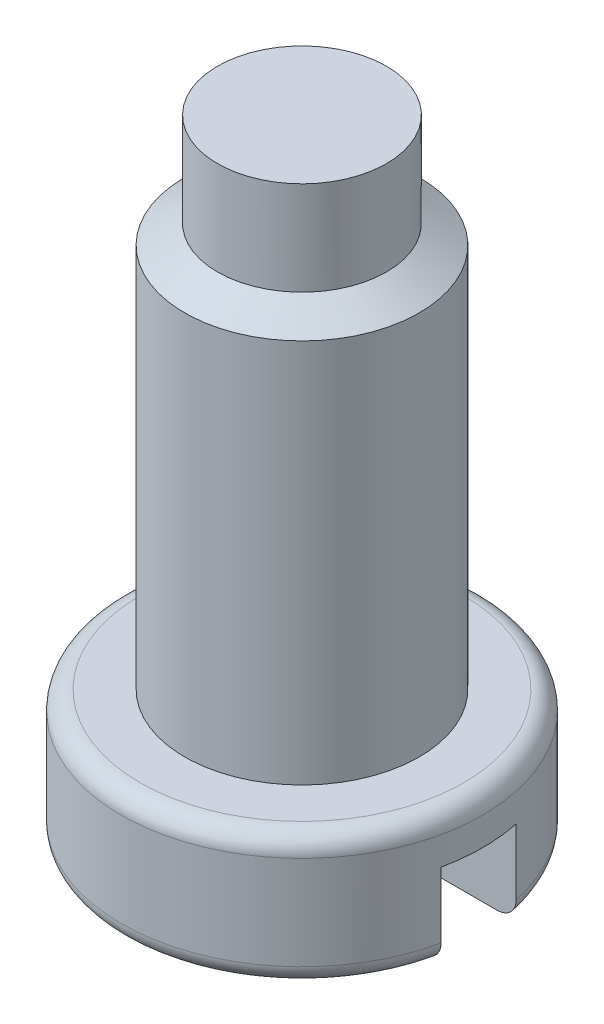
ISO-10303-21;
HEADER;
FILE_DESCRIPTION(('STEP AP214'),'2;1');
FILE_NAME('part.step','',(''),(''),'','','');
FILE_SCHEMA(('AUTOMOTIVE_DESIGN { 1 0 10303 214 1 1 1 1 }'));
ENDSEC;
DATA;
#1=APPLICATION_CONTEXT('core data for automotive mechanical design processes');
#2=APPLICATION_PROTOCOL_DEFINITION('international standard','automotive_design',2000,#1);
#3=PRODUCT_CONTEXT('',#1,'mechanical');
#4=PRODUCT('Part','Part','',(#3));
#5=PRODUCT_RELATED_PRODUCT_CATEGORY('part','',(#4));
#6=PRODUCT_DEFINITION_FORMATION('','',#4);
#7=PRODUCT_DEFINITION_CONTEXT('part definition',#1,'design');
#8=PRODUCT_DEFINITION('design','',#6,#7);
#9=PRODUCT_DEFINITION_SHAPE('','',#8);
#10=(LENGTH_UNIT() NAMED_UNIT(*) SI_UNIT(.MILLI.,.METRE.));
#11=(NAMED_UNIT(*) PLANE_ANGLE_UNIT() SI_UNIT($,.RADIAN.));
#12=(NAMED_UNIT(*) SI_UNIT($,.STERADIAN.) SOLID_ANGLE_UNIT());
#13=UNCERTAINTY_MEASURE_WITH_UNIT(LENGTH_MEASURE(1.E-05),#10,'distance_accuracy_value','');
#14=(GEOMETRIC_REPRESENTATION_CONTEXT(3) GLOBAL_UNCERTAINTY_ASSIGNED_CONTEXT((#13)) GLOBAL_UNIT_ASSIGNED_CONTEXT((#10,
#11,#12)) REPRESENTATION_CONTEXT('',''));
#15=CARTESIAN_POINT('',(0.,0.,0.));
#16=DIRECTION('',(0.,0.,1.));
#17=DIRECTION('',(1.,0.,0.));
#18=AXIS2_PLACEMENT_3D('',#15,#16,#17);
#19=CARTESIAN_POINT('',(5.91,1.7,16.95));
#20=DIRECTION('',(0.,-1.,0.));
#21=DIRECTION('',(0.,0.,-1.));
#22=AXIS2_PLACEMENT_3D('',#19,#20,#21);
#23=PLANE('',#22);
#24=CARTESIAN_POINT('',(0.,1.7,16.55));
#25=DIRECTION('',(0.,-1.,0.));
#26=DIRECTION('',(0.,0.,-1.));
#27=AXIS2_PLACEMENT_3D('',#24,#25,#26);
#28=CIRCLE('',#27,1.925);
#29=CARTESIAN_POINT('',(-1.88298300576503,1.7,16.95));
#30=VERTEX_POINT('',#29);
#31=CARTESIAN_POINT('',(-1.88298300576503,1.7,16.15));
#32=VERTEX_POINT('',#31);
#33=EDGE_CURVE('E78',#30,#32,#28,.T.);
#34=ORIENTED_EDGE('',*,*,#33,.T.);
#35=DIRECTION('',(1.,0.,0.));
#36=VECTOR('',#35,1.);
#37=CARTESIAN_POINT('',(5.91,1.7,16.15));
#38=LINE('',#37,#36);
#39=CARTESIAN_POINT('',(1.88298300576503,1.7,16.15));
#40=VERTEX_POINT('',#39);
#41=EDGE_CURVE('E80',#40,#32,#38,.F.);
#42=ORIENTED_EDGE('',*,*,#41,.F.);
#43=CARTESIAN_POINT('',(0.,1.7,16.55));
#44=DIRECTION('',(0.,-1.,0.));
#45=DIRECTION('',(0.,0.,-1.));
#46=AXIS2_PLACEMENT_3D('',#43,#44,#45);
#47=CIRCLE('',#46,1.925);
#48=CARTESIAN_POINT('',(1.88298300576503,1.7,16.95));
#49=VERTEX_POINT('',#48);
#50=EDGE_CURVE('E19',#40,#49,#47,.T.);
#51=ORIENTED_EDGE('',*,*,#50,.T.);
#52=DIRECTION('',(-1.,0.,0.));
#53=VECTOR('',#52,1.);
#54=CARTESIAN_POINT('',(5.91,1.7,16.95));
#55=LINE('',#54,#53);
#56=EDGE_CURVE('E87',#30,#49,#55,.F.);
#57=ORIENTED_EDGE('',*,*,#56,.F.);
#58=EDGE_LOOP('',(#34,#42,#51,#57));
#59=FACE_BOUND('',#58,.T.);
#60=ADVANCED_FACE('F16',(#59),#23,.T.);
#61=CARTESIAN_POINT('',(5.91,0.8,16.95));
#62=DIRECTION('',(0.,0.,-1.));
#63=DIRECTION('',(-1.,0.,0.));
#64=AXIS2_PLACEMENT_3D('',#61,#62,#63);
#65=PLANE('',#64);
#66=DIRECTION('',(0.,1.,0.));
#67=VECTOR('',#66,1.);
#68=CARTESIAN_POINT('',(-1.882983005765,0.8,16.95));
#69=LINE('',#68,#67);
#70=CARTESIAN_POINT('',(-1.88298300576503,1.,16.95));
#71=VERTEX_POINT('',#70);
#72=EDGE_CURVE('E89',#71,#30,#69,.T.);
#73=ORIENTED_EDGE('',*,*,#72,.T.);
#74=ORIENTED_EDGE('',*,*,#56,.T.);
#75=DIRECTION('',(0.,1.,0.));
#76=VECTOR('',#75,1.);
#77=CARTESIAN_POINT('',(1.882983005765,0.8,16.95));
#78=LINE('',#77,#76);
#79=CARTESIAN_POINT('',(1.88298300576503,1.,16.95));
#80=VERTEX_POINT('',#79);
#81=EDGE_CURVE('E74',#49,#80,#78,.F.);
#82=ORIENTED_EDGE('',*,*,#81,.T.);
#83=CARTESIAN_POINT('',(1.88298300576506,1.,16.95));
#84=CARTESIAN_POINT('',(1.88299347563166,0.988931574843076,16.95));
#85=CARTESIAN_POINT('',(1.88204434737266,0.977867312182217,16.95));
#86=CARTESIAN_POINT('',(1.8783056960026,0.956069104845353,16.95));
#87=CARTESIAN_POINT('',(1.87551868245182,0.94533473060846,16.95));
#88=CARTESIAN_POINT('',(1.86818161993845,0.924483467447971,16.95));
#89=CARTESIAN_POINT('',(1.86363106561843,0.914366756483745,16.95));
#90=CARTESIAN_POINT('',(1.85291153538853,0.895032206295592,16.95));
#91=CARTESIAN_POINT('',(1.84674258601823,0.885814352334973,16.95));
#92=CARTESIAN_POINT('',(1.83290967504187,0.868444958618102,16.95));
#93=CARTESIAN_POINT('',(1.82523296005815,0.860303582753486,16.95));
#94=CARTESIAN_POINT('',(1.8086458188045,0.845392527748904,16.95));
#95=CARTESIAN_POINT('',(1.79973518810624,0.838623076360581,16.95));
#96=CARTESIAN_POINT('',(1.78073608065166,0.826495402624658,16.95));
#97=CARTESIAN_POINT('',(1.77062677951454,0.821169841944041,16.95));
#98=CARTESIAN_POINT('',(1.7496724730191,0.812248699356854,16.95));
#99=CARTESIAN_POINT('',(1.7388276109373,0.808652781639017,16.95));
#100=CARTESIAN_POINT('',(1.71962129090437,0.803978647329365,16.95));
#101=CARTESIAN_POINT('',(1.71135775205097,0.802486821782124,16.95));
#102=CARTESIAN_POINT('',(1.69472437429364,0.800497521136283,16.95));
#103=CARTESIAN_POINT('',(1.68635471340121,0.799998558106696,16.95));
#104=CARTESIAN_POINT('',(1.67798241945499,0.8,16.95));
#105=B_SPLINE_CURVE_WITH_KNOTS('',3,(#83,#84,#85,#86,#87,#88,#89,#90,#91,#92,#93,#94,#95,#96,
#97,#98,#99,#100,#101,#102,#103,#104),.UNSPECIFIED.,.F.,.F.,(4,2,2,2,2,2,2,2,2,2,4),(0.,
0.0331584400419193,0.0662716970254844,0.0993944499159244,0.132516659670048,0.165932136904907,
0.199353156869892,0.233476817049018,0.267593849421269,0.292728302229871,0.317825059404467),.UNSPECIFIED.);
#106=CARTESIAN_POINT('',(1.677982419455,0.8,16.95));
#107=VERTEX_POINT('',#106);
#108=EDGE_CURVE('E97',#80,#107,#105,.T.);
#109=ORIENTED_EDGE('',*,*,#108,.T.);
#110=DIRECTION('',(1.,0.,0.));
#111=VECTOR('',#110,1.);
#112=CARTESIAN_POINT('',(0.,0.8,16.95));
#113=LINE('',#112,#111);
#114=CARTESIAN_POINT('',(-1.677982419455,0.8,16.95));
#115=VERTEX_POINT('',#114);
#116=EDGE_CURVE('E105',#115,#107,#113,.T.);
#117=ORIENTED_EDGE('',*,*,#116,.F.);
#118=CARTESIAN_POINT('',(-1.677982419455,0.8,16.95));
#119=CARTESIAN_POINT('',(-1.68974282333881,0.799991194823766,16.9500000000022));
#120=CARTESIAN_POINT('',(-1.70150318088781,0.800981078367557,16.9500000000013));
#121=CARTESIAN_POINT('',(-1.72469677261126,0.804903299902078,16.9499999999987));
#122=CARTESIAN_POINT('',(-1.73612996909695,0.807835860755747,16.949999999997));
#123=CARTESIAN_POINT('',(-1.75834906575045,0.815591879157631,16.9499999999984));
#124=CARTESIAN_POINT('',(-1.76913439134307,0.820416987405248,16.9500000000015));
#125=CARTESIAN_POINT('',(-1.78972042522975,0.831834228342233,16.9499999999985));
#126=CARTESIAN_POINT('',(-1.79952158265651,0.838425549922025,16.9499999999924));
#127=CARTESIAN_POINT('',(-1.81770326069163,0.853092062358443,16.9499999999937));
#128=CARTESIAN_POINT('',(-1.8261027161158,0.861143764615979,16.9500000000009));
#129=CARTESIAN_POINT('',(-1.84138927017368,0.878572938200564,16.9499999999991));
#130=CARTESIAN_POINT('',(-1.84827671395276,0.887950106159836,16.94999999999));
#131=CARTESIAN_POINT('',(-1.86017428150044,0.90752681891112,16.9499999999906));
#132=CARTESIAN_POINT('',(-1.86522451225429,0.917702026884014,16.9499999999998));
#133=CARTESIAN_POINT('',(-1.87350315875885,0.938763911500687,16.9500000000002));
#134=CARTESIAN_POINT('',(-1.87673324848014,0.949649924104637,16.9499999999913));
#135=CARTESIAN_POINT('',(-1.88032527373272,0.967186966849053,16.9499999999931));
#136=CARTESIAN_POINT('',(-1.88132142626072,0.973714484211891,16.9499999999972));
#137=CARTESIAN_POINT('',(-1.88265004809528,0.9868269578464,16.9500000000028));
#138=CARTESIAN_POINT('',(-1.88298349511185,0.993411815084606,16.9500000000044));
#139=CARTESIAN_POINT('',(-1.88298300576506,0.999999999999997,16.95));
#140=B_SPLINE_CURVE_WITH_KNOTS('',3,(#118,#119,#120,#121,#122,#123,#124,#125,#126,#127,#128,
#129,#130,#131,#132,#133,#134,#135,#136,#137,#138,#139),.UNSPECIFIED.,.F.,.F.,(4,2,2,2,2,2,2,2,
2,2,4),(0.,0.0352399194187343,0.0704838822431085,0.105758653819415,0.141017253615036,
0.175752271482578,0.210479352159553,0.244394958270078,0.278279321319094,0.298058128929664,
0.317807734526125),.UNSPECIFIED.);
#141=EDGE_CURVE('E96',#115,#71,#140,.T.);
#142=ORIENTED_EDGE('',*,*,#141,.T.);
#143=EDGE_LOOP('',(#73,#74,#82,#109,#117,#142));
#144=FACE_BOUND('',#143,.T.);
#145=ADVANCED_FACE('F203',(#144),#65,.T.);
#146=CARTESIAN_POINT('',(5.91,1.7,16.15));
#147=DIRECTION('',(0.,0.,1.));
#148=DIRECTION('',(1.,0.,0.));
#149=AXIS2_PLACEMENT_3D('',#146,#147,#148);
#150=PLANE('',#149);
#151=DIRECTION('',(1.,0.,0.));
#152=VECTOR('',#151,1.);
#153=CARTESIAN_POINT('',(0.,0.8,16.15));
#154=LINE('',#153,#152);
#155=CARTESIAN_POINT('',(1.677982419455,0.8,16.15));
#156=VERTEX_POINT('',#155);
#157=CARTESIAN_POINT('',(-1.677982419455,0.8,16.15));
#158=VERTEX_POINT('',#157);
#159=EDGE_CURVE('E150',#156,#158,#154,.F.);
#160=ORIENTED_EDGE('',*,*,#159,.F.);
#161=CARTESIAN_POINT('',(1.677982419455,0.8,16.15));
#162=CARTESIAN_POINT('',(1.68974282333881,0.799991194823766,16.1499999999978));
#163=CARTESIAN_POINT('',(1.70150318088781,0.800981078367557,16.1499999999987));
#164=CARTESIAN_POINT('',(1.72469677261126,0.804903299902078,16.1500000000013));
#165=CARTESIAN_POINT('',(1.73612996909695,0.807835860755748,16.150000000003));
#166=CARTESIAN_POINT('',(1.75834906575045,0.815591879157631,16.1500000000016));
#167=CARTESIAN_POINT('',(1.76913439134306,0.820416987405248,16.1499999999985));
#168=CARTESIAN_POINT('',(1.78972042522975,0.831834228342234,16.1500000000015));
#169=CARTESIAN_POINT('',(1.79952158265651,0.838425549922026,16.1500000000076));
#170=CARTESIAN_POINT('',(1.81770326069163,0.853092062358444,16.1500000000063));
#171=CARTESIAN_POINT('',(1.82610271611579,0.86114376461598,16.1499999999991));
#172=CARTESIAN_POINT('',(1.84138927017368,0.878572938200565,16.1500000000009));
#173=CARTESIAN_POINT('',(1.84827671395276,0.887950106159837,16.15000000001));
#174=CARTESIAN_POINT('',(1.86017428150044,0.907526818911122,16.1500000000094));
#175=CARTESIAN_POINT('',(1.86522451225429,0.917702026884015,16.1500000000002));
#176=CARTESIAN_POINT('',(1.87350315875884,0.938763911500687,16.1499999999998));
#177=CARTESIAN_POINT('',(1.87673324848014,0.949649924104638,16.1500000000087));
#178=CARTESIAN_POINT('',(1.88032527373272,0.967186966849053,16.1500000000069));
#179=CARTESIAN_POINT('',(1.88132142626072,0.973714484211891,16.1500000000028));
#180=CARTESIAN_POINT('',(1.88265004809528,0.9868269578464,16.1499999999972));
#181=CARTESIAN_POINT('',(1.88298349511184,0.993411815084606,16.1499999999956));
#182=CARTESIAN_POINT('',(1.88298300576506,0.999999999999997,16.15));
#183=B_SPLINE_CURVE_WITH_KNOTS('',3,(#161,#162,#163,#164,#165,#166,#167,#168,#169,#170,#171,
#172,#173,#174,#175,#176,#177,#178,#179,#180,#181,#182),.UNSPECIFIED.,.F.,.F.,(4,2,2,2,2,2,2,2,
2,2,4),(0.,0.0352399194187334,0.0704838822431072,0.105758653819414,0.141017253615035,
0.175752271482576,0.210479352159551,0.244394958270075,0.278279321319092,0.298058128929661,
0.317807734526122),.UNSPECIFIED.);
#184=CARTESIAN_POINT('',(1.88298300576503,1.,16.15));
#185=VERTEX_POINT('',#184);
#186=EDGE_CURVE('E86',#156,#185,#183,.T.);
#187=ORIENTED_EDGE('',*,*,#186,.T.);
#188=DIRECTION('',(0.,1.,0.));
#189=VECTOR('',#188,1.);
#190=CARTESIAN_POINT('',(1.882983005765,1.7,16.15));
#191=LINE('',#190,#189);
#192=EDGE_CURVE('E70',#185,#40,#191,.T.);
#193=ORIENTED_EDGE('',*,*,#192,.T.);
#194=ORIENTED_EDGE('',*,*,#41,.T.);
#195=DIRECTION('',(0.,1.,0.));
#196=VECTOR('',#195,1.);
#197=CARTESIAN_POINT('',(-1.882983005765,1.7,16.15));
#198=LINE('',#197,#196);
#199=CARTESIAN_POINT('',(-1.88298300576503,1.,16.15));
#200=VERTEX_POINT('',#199);
#201=EDGE_CURVE('E82',#32,#200,#198,.F.);
#202=ORIENTED_EDGE('',*,*,#201,.T.);
#203=CARTESIAN_POINT('',(-1.88298300576505,1.,16.15));
#204=CARTESIAN_POINT('',(-1.88299347563166,0.988931574843076,16.15));
#205=CARTESIAN_POINT('',(-1.88204434737266,0.977867312182217,16.15));
#206=CARTESIAN_POINT('',(-1.8783056960026,0.956069104845353,16.15));
#207=CARTESIAN_POINT('',(-1.87551868245182,0.94533473060846,16.15));
#208=CARTESIAN_POINT('',(-1.86818161993845,0.924483467447971,16.15));
#209=CARTESIAN_POINT('',(-1.86363106561843,0.914366756483745,16.15));
#210=CARTESIAN_POINT('',(-1.85291153538853,0.895032206295592,16.15));
#211=CARTESIAN_POINT('',(-1.84674258601822,0.885814352334973,16.15));
#212=CARTESIAN_POINT('',(-1.83290967504187,0.868444958618102,16.15));
#213=CARTESIAN_POINT('',(-1.82523296005815,0.860303582753486,16.15));
#214=CARTESIAN_POINT('',(-1.8086458188045,0.845392527748904,16.15));
#215=CARTESIAN_POINT('',(-1.79973518810623,0.838623076360581,16.15));
#216=CARTESIAN_POINT('',(-1.78073608065165,0.826495402624658,16.15));
#217=CARTESIAN_POINT('',(-1.77062677951454,0.821169841944041,16.15));
#218=CARTESIAN_POINT('',(-1.7496724730191,0.812248699356853,16.15));
#219=CARTESIAN_POINT('',(-1.73882761093729,0.808652781639016,16.15));
#220=CARTESIAN_POINT('',(-1.71962129090437,0.803978647329365,16.15));
#221=CARTESIAN_POINT('',(-1.71135775205097,0.802486821782124,16.15));
#222=CARTESIAN_POINT('',(-1.69472437429364,0.800497521136283,16.15));
#223=CARTESIAN_POINT('',(-1.68635471340121,0.799998558106696,16.15));
#224=CARTESIAN_POINT('',(-1.67798241945499,0.8,16.15));
#225=B_SPLINE_CURVE_WITH_KNOTS('',3,(#203,#204,#205,#206,#207,#208,#209,#210,#211,#212,#213,
#214,#215,#216,#217,#218,#219,#220,#221,#222,#223,#224),.UNSPECIFIED.,.F.,.F.,(4,2,2,2,2,2,2,2,
2,2,4),(0.,0.0331584400419191,0.0662716970254844,0.0993944499159245,0.132516659670047,
0.165932136904907,0.199353156869893,0.233476817049018,0.267593849421269,0.292728302229869,
0.317825059404463),.UNSPECIFIED.);
#226=EDGE_CURVE('E34',#200,#158,#225,.T.);
#227=ORIENTED_EDGE('',*,*,#226,.T.);
#228=EDGE_LOOP('',(#160,#187,#193,#194,#202,#227));
#229=FACE_BOUND('',#228,.T.);
#230=ADVANCED_FACE('F85',(#229),#150,.T.);
#231=CARTESIAN_POINT('',(0.,0.8,16.55));
#232=DIRECTION('',(0.,-1.,0.));
#233=DIRECTION('',(0.,0.,-1.));
#234=AXIS2_PLACEMENT_3D('',#231,#232,#233);
#235=PLANE('',#234);
#236=ORIENTED_EDGE('',*,*,#116,.T.);
#237=CARTESIAN_POINT('',(0.,0.8,16.55));
#238=DIRECTION('',(0.,1.,0.));
#239=DIRECTION('',(-0.972743431568108,0.,0.231884057971009));
#240=AXIS2_PLACEMENT_3D('',#237,#238,#239);
#241=CIRCLE('',#240,1.72500000000001);
#242=EDGE_CURVE('E182',#115,#107,#241,.T.);
#243=ORIENTED_EDGE('',*,*,#242,.F.);
#244=EDGE_LOOP('',(#236,#243));
#245=FACE_BOUND('',#244,.T.);
#246=ADVANCED_FACE('F160',(#245),#235,.T.);
#247=CARTESIAN_POINT('',(0.,0.8,16.55));
#248=DIRECTION('',(0.,-1.,0.));
#249=DIRECTION('',(0.,0.,-1.));
#250=AXIS2_PLACEMENT_3D('',#247,#248,#249);
#251=PLANE('',#250);
#252=ORIENTED_EDGE('',*,*,#159,.T.);
#253=CARTESIAN_POINT('',(0.,0.8,16.55));
#254=DIRECTION('',(0.,1.,0.));
#255=DIRECTION('',(0.972743431568106,0.,-0.231884057971017));
#256=AXIS2_PLACEMENT_3D('',#253,#254,#255);
#257=CIRCLE('',#256,1.72500000000002);
#258=EDGE_CURVE('E142',#156,#158,#257,.T.);
#259=ORIENTED_EDGE('',*,*,#258,.F.);
#260=EDGE_LOOP('',(#252,#259));
#261=FACE_BOUND('',#260,.T.);
#262=ADVANCED_FACE('F152',(#261),#251,.T.);
#263=CARTESIAN_POINT('',(0.,1.,16.55));
#264=DIRECTION('',(0.,-1.,0.));
#265=DIRECTION('',(0.,0.,-1.));
#266=AXIS2_PLACEMENT_3D('',#263,#264,#265);
#267=TOROIDAL_SURFACE('',#266,1.725,0.2);
#268=CARTESIAN_POINT('',(0.,1.,16.55));
#269=DIRECTION('',(0.,-1.,0.));
#270=DIRECTION('',(0.,0.,-1.));
#271=AXIS2_PLACEMENT_3D('',#268,#269,#270);
#272=CIRCLE('',#271,1.925);
#273=EDGE_CURVE('E138',#71,#80,#272,.F.);
#274=ORIENTED_EDGE('',*,*,#273,.F.);
#275=ORIENTED_EDGE('',*,*,#141,.F.);
#276=ORIENTED_EDGE('',*,*,#242,.T.);
#277=ORIENTED_EDGE('',*,*,#108,.F.);
#278=EDGE_LOOP('',(#274,#275,#276,#277));
#279=FACE_BOUND('',#278,.T.);
#280=ADVANCED_FACE('F123',(#279),#267,.T.);
#281=CARTESIAN_POINT('',(0.,1.,16.55));
#282=DIRECTION('',(0.,-1.,0.));
#283=DIRECTION('',(0.,0.,-1.));
#284=AXIS2_PLACEMENT_3D('',#281,#282,#283);
#285=TOROIDAL_SURFACE('',#284,1.725,0.2);
#286=ORIENTED_EDGE('',*,*,#258,.T.);
#287=ORIENTED_EDGE('',*,*,#226,.F.);
#288=CARTESIAN_POINT('',(0.,1.,16.55));
#289=DIRECTION('',(0.,-1.,0.));
#290=DIRECTION('',(0.,0.,-1.));
#291=AXIS2_PLACEMENT_3D('',#288,#289,#290);
#292=CIRCLE('',#291,1.925);
#293=EDGE_CURVE('E103',#185,#200,#292,.F.);
#294=ORIENTED_EDGE('',*,*,#293,.F.);
#295=ORIENTED_EDGE('',*,*,#186,.F.);
#296=EDGE_LOOP('',(#286,#287,#294,#295));
#297=FACE_BOUND('',#296,.T.);
#298=ADVANCED_FACE('F116',(#297),#285,.T.);
#299=CARTESIAN_POINT('',(0.,7.5,16.55));
#300=DIRECTION('',(0.,-1.,0.));
#301=DIRECTION('',(0.,0.,-1.));
#302=AXIS2_PLACEMENT_3D('',#299,#300,#301);
#303=PLANE('',#302);
#304=CARTESIAN_POINT('',(0.,7.5,16.55));
#305=DIRECTION('',(0.,-1.,0.));
#306=DIRECTION('',(0.,0.,-1.));
#307=AXIS2_PLACEMENT_3D('',#304,#305,#306);
#308=CIRCLE('',#307,0.9);
#309=CARTESIAN_POINT('',(0.,7.5,15.65));
#310=VERTEX_POINT('',#309);
#311=EDGE_CURVE('E99',#310,#310,#308,.T.);
#312=ORIENTED_EDGE('',*,*,#311,.F.);
#313=EDGE_LOOP('',(#312));
#314=FACE_BOUND('',#313,.T.);
#315=ADVANCED_FACE('F122',(#314),#303,.F.);
#316=CARTESIAN_POINT('',(0.,0.465,16.55));
#317=DIRECTION('',(0.,-1.,0.));
#318=DIRECTION('',(0.,0.,-1.));
#319=AXIS2_PLACEMENT_3D('',#316,#317,#318);
#320=CYLINDRICAL_SURFACE('',#319,1.925);
#321=CARTESIAN_POINT('',(0.,2.,16.55));
#322=DIRECTION('',(0.,-1.,0.));
#323=DIRECTION('',(0.,0.,-1.));
#324=AXIS2_PLACEMENT_3D('',#321,#322,#323);
#325=CIRCLE('',#324,1.925);
#326=CARTESIAN_POINT('',(0.,2.,14.625));
#327=VERTEX_POINT('',#326);
#328=EDGE_CURVE('E102',#327,#327,#325,.F.);
#329=ORIENTED_EDGE('',*,*,#328,.F.);
#330=EDGE_LOOP('',(#329));
#331=FACE_BOUND('',#330,.T.);
#332=ORIENTED_EDGE('',*,*,#33,.F.);
#333=ORIENTED_EDGE('',*,*,#72,.F.);
#334=ORIENTED_EDGE('',*,*,#273,.T.);
#335=ORIENTED_EDGE('',*,*,#81,.F.);
#336=ORIENTED_EDGE('',*,*,#50,.F.);
#337=ORIENTED_EDGE('',*,*,#192,.F.);
#338=ORIENTED_EDGE('',*,*,#293,.T.);
#339=ORIENTED_EDGE('',*,*,#201,.F.);
#340=EDGE_LOOP('',(#332,#333,#334,#335,#336,#337,#338,#339));
#341=FACE_BOUND('',#340,.T.);
#342=ADVANCED_FACE('F67',(#331,#341),#320,.T.);
#343=CARTESIAN_POINT('',(0.,0.465,16.55));
#344=DIRECTION('',(0.,-1.,0.));
#345=DIRECTION('',(0.,0.,-1.));
#346=AXIS2_PLACEMENT_3D('',#343,#344,#345);
#347=CYLINDRICAL_SURFACE('',#346,0.9);
#348=CARTESIAN_POINT('',(0.,6.5000000002442,16.55));
#349=DIRECTION('',(0.,-1.,0.));
#350=DIRECTION('',(0.,0.,1.));
#351=AXIS2_PLACEMENT_3D('',#348,#349,#350);
#352=CIRCLE('',#351,0.900000000167159);
#353=CARTESIAN_POINT('',(0.,6.5000000002442,17.4500000001672));
#354=VERTEX_POINT('',#353);
#355=EDGE_CURVE('E249',#354,#354,#352,.T.);
#356=ORIENTED_EDGE('',*,*,#355,.F.);
#357=EDGE_LOOP('',(#356));
#358=FACE_BOUND('',#357,.T.);
#359=ORIENTED_EDGE('',*,*,#311,.T.);
#360=EDGE_LOOP('',(#359));
#361=FACE_BOUND('',#360,.T.);
#362=ADVANCED_FACE('F267',(#358,#361),#347,.T.);
#363=CARTESIAN_POINT('',(0.,2.,16.55));
#364=DIRECTION('',(0.,-1.,0.));
#365=DIRECTION('',(0.,0.,-1.));
#366=AXIS2_PLACEMENT_3D('',#363,#364,#365);
#367=TOROIDAL_SURFACE('',#366,1.725,0.2);
#368=ORIENTED_EDGE('',*,*,#328,.T.);
#369=EDGE_LOOP('',(#368));
#370=FACE_BOUND('',#369,.T.);
#371=CARTESIAN_POINT('',(0.,2.2,16.55));
#372=DIRECTION('',(0.,-1.,0.));
#373=DIRECTION('',(0.,0.,1.));
#374=AXIS2_PLACEMENT_3D('',#371,#372,#373);
#375=CIRCLE('',#374,1.72499999999999);
#376=CARTESIAN_POINT('',(0.,2.2,18.275));
#377=VERTEX_POINT('',#376);
#378=EDGE_CURVE('E257',#377,#377,#375,.T.);
#379=ORIENTED_EDGE('',*,*,#378,.T.);
#380=EDGE_LOOP('',(#379));
#381=FACE_BOUND('',#380,.T.);
#382=ADVANCED_FACE('F263',(#370,#381),#367,.T.);
#383=CARTESIAN_POINT('',(0.,6.29792740556923,16.55));
#384=DIRECTION('',(0.,-1.,0.));
#385=DIRECTION('',(0.,0.,-1.));
#386=AXIS2_PLACEMENT_3D('',#383,#384,#385);
#387=CONICAL_SURFACE('',#386,1.24999999990877,1.0471975498942);
#388=ORIENTED_EDGE('',*,*,#355,.T.);
#389=EDGE_LOOP('',(#388));
#390=FACE_BOUND('',#389,.T.);
#391=CARTESIAN_POINT('',(0.,6.297927405784,16.55));
#392=DIRECTION('',(0.,-1.,0.));
#393=DIRECTION('',(0.,0.,-1.));
#394=AXIS2_PLACEMENT_3D('',#391,#392,#393);
#395=CIRCLE('',#394,1.25);
#396=CARTESIAN_POINT('',(0.,6.297927405784,15.3));
#397=VERTEX_POINT('',#396);
#398=EDGE_CURVE('E25',#397,#397,#395,.T.);
#399=ORIENTED_EDGE('',*,*,#398,.F.);
#400=EDGE_LOOP('',(#399));
#401=FACE_BOUND('',#400,.T.);
#402=ADVANCED_FACE('F236',(#390,#401),#387,.T.);
#403=CARTESIAN_POINT('',(0.,2.2,16.55));
#404=DIRECTION('',(0.,-1.,0.));
#405=DIRECTION('',(0.,0.,-1.));
#406=AXIS2_PLACEMENT_3D('',#403,#404,#405);
#407=PLANE('',#406);
#408=CARTESIAN_POINT('',(0.,2.2,16.55));
#409=DIRECTION('',(0.,-1.,0.));
#410=DIRECTION('',(0.,0.,-1.));
#411=AXIS2_PLACEMENT_3D('',#408,#409,#410);
#412=CIRCLE('',#411,1.25);
#413=CARTESIAN_POINT('',(0.,2.2,15.3));
#414=VERTEX_POINT('',#413);
#415=EDGE_CURVE('E11',#414,#414,#412,.F.);
#416=ORIENTED_EDGE('',*,*,#415,.F.);
#417=EDGE_LOOP('',(#416));
#418=FACE_BOUND('',#417,.T.);
#419=ORIENTED_EDGE('',*,*,#378,.F.);
#420=EDGE_LOOP('',(#419));
#421=FACE_BOUND('',#420,.T.);
#422=ADVANCED_FACE('F230',(#418,#421),#407,.F.);
#423=CARTESIAN_POINT('',(0.,0.465,16.55));
#424=DIRECTION('',(0.,-1.,0.));
#425=DIRECTION('',(0.,0.,-1.));
#426=AXIS2_PLACEMENT_3D('',#423,#424,#425);
#427=CYLINDRICAL_SURFACE('',#426,1.25);
#428=ORIENTED_EDGE('',*,*,#415,.T.);
#429=EDGE_LOOP('',(#428));
#430=FACE_BOUND('',#429,.T.);
#431=ORIENTED_EDGE('',*,*,#398,.T.);
#432=EDGE_LOOP('',(#431));
#433=FACE_BOUND('',#432,.T.);
#434=ADVANCED_FACE('F228',(#430,#433),#427,.T.);
#435=CLOSED_SHELL('',(#60,#145,#230,#246,#262,#280,#298,#315,#342,#362,#382,#402,#422,#434));
#436=MANIFOLD_SOLID_BREP('B1',#435);
#437=ADVANCED_BREP_SHAPE_REPRESENTATION('',(#18,#436),#14);
#438=SHAPE_DEFINITION_REPRESENTATION(#9,#437);
ENDSEC;
END-ISO-10303-21;
